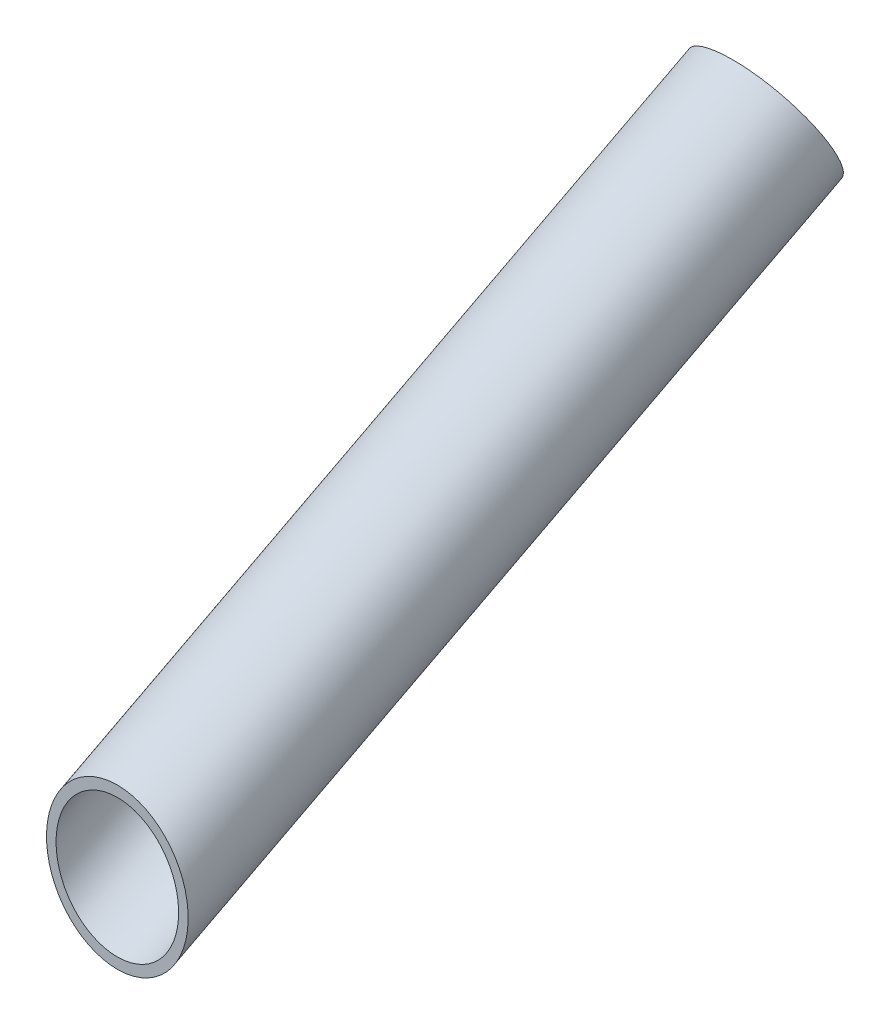
ISO-10303-21;
HEADER;
FILE_DESCRIPTION(('STEP AP214'),'2;1');
FILE_NAME('part.step','',(''),(''),'','','');
FILE_SCHEMA(('AUTOMOTIVE_DESIGN { 1 0 10303 214 1 1 1 1 }'));
ENDSEC;
DATA;
#1=APPLICATION_CONTEXT('core data for automotive mechanical design processes');
#2=APPLICATION_PROTOCOL_DEFINITION('international standard','automotive_design',2000,#1);
#3=PRODUCT_CONTEXT('',#1,'mechanical');
#4=PRODUCT('Part','Part','',(#3));
#5=PRODUCT_RELATED_PRODUCT_CATEGORY('part','',(#4));
#6=PRODUCT_DEFINITION_FORMATION('','',#4);
#7=PRODUCT_DEFINITION_CONTEXT('part definition',#1,'design');
#8=PRODUCT_DEFINITION('design','',#6,#7);
#9=PRODUCT_DEFINITION_SHAPE('','',#8);
#10=(LENGTH_UNIT() NAMED_UNIT(*) SI_UNIT(.MILLI.,.METRE.));
#11=(NAMED_UNIT(*) PLANE_ANGLE_UNIT() SI_UNIT($,.RADIAN.));
#12=(NAMED_UNIT(*) SI_UNIT($,.STERADIAN.) SOLID_ANGLE_UNIT());
#13=UNCERTAINTY_MEASURE_WITH_UNIT(LENGTH_MEASURE(1.E-05),#10,'distance_accuracy_value','');
#14=(GEOMETRIC_REPRESENTATION_CONTEXT(3) GLOBAL_UNCERTAINTY_ASSIGNED_CONTEXT((#13)) GLOBAL_UNIT_ASSIGNED_CONTEXT((#10,
#11,#12)) REPRESENTATION_CONTEXT('',''));
#15=CARTESIAN_POINT('',(0.,0.,0.));
#16=DIRECTION('',(0.,0.,1.));
#17=DIRECTION('',(1.,0.,0.));
#18=AXIS2_PLACEMENT_3D('',#15,#16,#17);
#19=CARTESIAN_POINT('',(-168.933298653689,-43.0993241338873,-19.7646398099188));
#20=DIRECTION('',(0.,0.461748613235035,-0.887010833178221));
#21=DIRECTION('',(0.,0.887010833178221,0.461748613235035));
#22=AXIS2_PLACEMENT_3D('',#19,#20,#21);
#23=CYLINDRICAL_SURFACE('',#22,26.);
#24=CARTESIAN_POINT('',(-168.93329865369,-6.98001664315852,-89.1491839381843));
#25=DIRECTION('',(0.,0.,1.));
#26=DIRECTION('',(0.,1.,0.));
#27=AXIS2_PLACEMENT_3D('',#24,#25,#26);
#28=ELLIPSE('',#27,29.3119306185249,26.);
#29=CARTESIAN_POINT('',(-168.93329865369,22.3319139753664,-89.1491839381843));
#30=VERTEX_POINT('',#29);
#31=EDGE_CURVE('E35',#30,#30,#28,.F.);
#32=ORIENTED_EDGE('',*,*,#31,.T.);
#33=EDGE_LOOP('',(#32));
#34=FACE_BOUND('',#33,.T.);
#35=CARTESIAN_POINT('',(-168.933298653691,116.870125644685,-327.063093695966));
#36=DIRECTION('',(0.,0.461748613235035,-0.887010833178221));
#37=DIRECTION('',(0.,0.887010833178221,0.461748613235035));
#38=AXIS2_PLACEMENT_3D('',#35,#36,#37);
#39=CIRCLE('',#38,26.);
#40=CARTESIAN_POINT('',(-168.933298653691,139.932407307318,-315.057629751855));
#41=VERTEX_POINT('',#40);
#42=EDGE_CURVE('E42',#41,#41,#39,.T.);
#43=ORIENTED_EDGE('',*,*,#42,.F.);
#44=EDGE_LOOP('',(#43));
#45=FACE_BOUND('',#44,.T.);
#46=ADVANCED_FACE('F31',(#34,#45),#23,.T.);
#47=CARTESIAN_POINT('',(-168.933298653689,-43.0993241338873,-19.7646398099188));
#48=DIRECTION('',(0.,0.461748613235035,-0.887010833178221));
#49=DIRECTION('',(0.,0.887010833178221,0.461748613235035));
#50=AXIS2_PLACEMENT_3D('',#47,#48,#49);
#51=CYLINDRICAL_SURFACE('',#50,22.5);
#52=CARTESIAN_POINT('',(-168.93329865369,-6.98001664315852,-89.1491839381843));
#53=DIRECTION('',(0.,0.,1.));
#54=DIRECTION('',(0.,1.,0.));
#55=AXIS2_PLACEMENT_3D('',#52,#53,#54);
#56=ELLIPSE('',#55,25.3660938044927,22.5);
#57=CARTESIAN_POINT('',(-168.93329865369,18.3860771613342,-89.1491839381843));
#58=VERTEX_POINT('',#57);
#59=EDGE_CURVE('E10',#58,#58,#56,.F.);
#60=ORIENTED_EDGE('',*,*,#59,.F.);
#61=EDGE_LOOP('',(#60));
#62=FACE_BOUND('',#61,.T.);
#63=CARTESIAN_POINT('',(-168.933298653691,116.870125644685,-327.063093695966));
#64=DIRECTION('',(0.,0.461748613235035,-0.887010833178221));
#65=DIRECTION('',(0.,0.887010833178221,0.461748613235035));
#66=AXIS2_PLACEMENT_3D('',#63,#64,#65);
#67=CIRCLE('',#66,22.5);
#68=CARTESIAN_POINT('',(-168.933298653691,136.827869391195,-316.673749898178));
#69=VERTEX_POINT('',#68);
#70=EDGE_CURVE('E46',#69,#69,#67,.T.);
#71=ORIENTED_EDGE('',*,*,#70,.T.);
#72=EDGE_LOOP('',(#71));
#73=FACE_BOUND('',#72,.T.);
#74=ADVANCED_FACE('F50',(#62,#73),#51,.F.);
#75=CARTESIAN_POINT('',(-214.43329865369,77.4184630599091,-89.1491839381842));
#76=DIRECTION('',(0.,0.,1.));
#77=DIRECTION('',(1.,0.,0.));
#78=AXIS2_PLACEMENT_3D('',#75,#76,#77);
#79=PLANE('',#78);
#80=ORIENTED_EDGE('',*,*,#31,.F.);
#81=EDGE_LOOP('',(#80));
#82=FACE_BOUND('',#81,.T.);
#83=ORIENTED_EDGE('',*,*,#59,.T.);
#84=EDGE_LOOP('',(#83));
#85=FACE_BOUND('',#84,.T.);
#86=ADVANCED_FACE('F33',(#82,#85),#79,.T.);
#87=CARTESIAN_POINT('',(-168.933298653691,116.870125644685,-327.063093695966));
#88=DIRECTION('',(0.,0.461748613235035,-0.887010833178221));
#89=DIRECTION('',(0.,0.887010833178221,0.461748613235035));
#90=AXIS2_PLACEMENT_3D('',#87,#88,#89);
#91=PLANE('',#90);
#92=ORIENTED_EDGE('',*,*,#42,.T.);
#93=EDGE_LOOP('',(#92));
#94=FACE_BOUND('',#93,.T.);
#95=ORIENTED_EDGE('',*,*,#70,.F.);
#96=EDGE_LOOP('',(#95));
#97=FACE_BOUND('',#96,.T.);
#98=ADVANCED_FACE('F52',(#94,#97),#91,.T.);
#99=CLOSED_SHELL('',(#46,#74,#86,#98));
#100=MANIFOLD_SOLID_BREP('B2',#99);
#101=ADVANCED_BREP_SHAPE_REPRESENTATION('',(#18,#100),#14);
#102=SHAPE_DEFINITION_REPRESENTATION(#9,#101);
ENDSEC;
END-ISO-10303-21;
